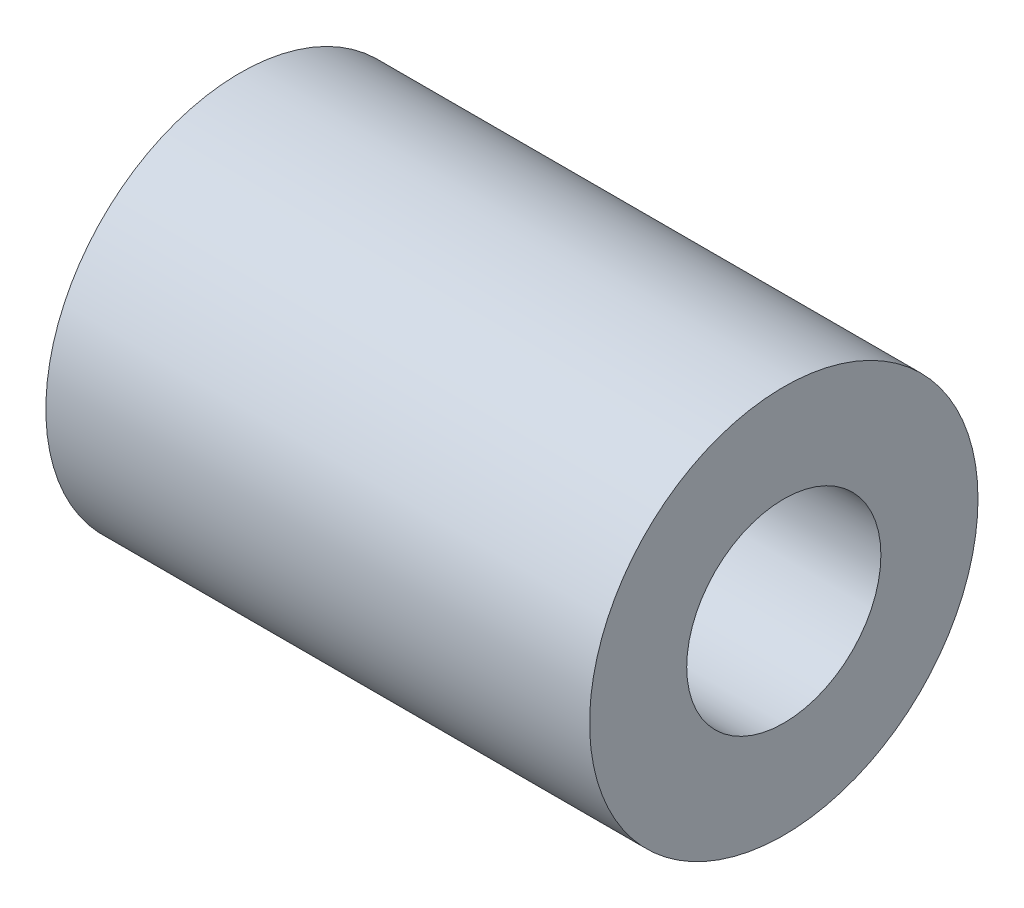
ISO-10303-21;
HEADER;
FILE_DESCRIPTION(('STEP AP214'),'2;1');
FILE_NAME('part.step','',(''),(''),'','','');
FILE_SCHEMA(('AUTOMOTIVE_DESIGN { 1 0 10303 214 1 1 1 1 }'));
ENDSEC;
DATA;
#1=APPLICATION_CONTEXT('core data for automotive mechanical design processes');
#2=APPLICATION_PROTOCOL_DEFINITION('international standard','automotive_design',2000,#1);
#3=PRODUCT_CONTEXT('',#1,'mechanical');
#4=PRODUCT('Part','Part','',(#3));
#5=PRODUCT_RELATED_PRODUCT_CATEGORY('part','',(#4));
#6=PRODUCT_DEFINITION_FORMATION('','',#4);
#7=PRODUCT_DEFINITION_CONTEXT('part definition',#1,'design');
#8=PRODUCT_DEFINITION('design','',#6,#7);
#9=PRODUCT_DEFINITION_SHAPE('','',#8);
#10=(LENGTH_UNIT() NAMED_UNIT(*) SI_UNIT(.MILLI.,.METRE.));
#11=(NAMED_UNIT(*) PLANE_ANGLE_UNIT() SI_UNIT($,.RADIAN.));
#12=(NAMED_UNIT(*) SI_UNIT($,.STERADIAN.) SOLID_ANGLE_UNIT());
#13=UNCERTAINTY_MEASURE_WITH_UNIT(LENGTH_MEASURE(1.E-05),#10,'distance_accuracy_value','');
#14=(GEOMETRIC_REPRESENTATION_CONTEXT(3) GLOBAL_UNCERTAINTY_ASSIGNED_CONTEXT((#13)) GLOBAL_UNIT_ASSIGNED_CONTEXT((#10,
#11,#12)) REPRESENTATION_CONTEXT('',''));
#15=CARTESIAN_POINT('',(0.,0.,0.));
#16=DIRECTION('',(0.,0.,1.));
#17=DIRECTION('',(1.,0.,0.));
#18=AXIS2_PLACEMENT_3D('',#15,#16,#17);
#19=CARTESIAN_POINT('',(7.,0.,0.));
#20=DIRECTION('',(1.,0.,0.));
#21=DIRECTION('',(0.,0.,-1.));
#22=AXIS2_PLACEMENT_3D('',#19,#20,#21);
#23=PLANE('',#22);
#24=CARTESIAN_POINT('',(7.,0.,0.));
#25=DIRECTION('',(1.,0.,0.));
#26=DIRECTION('',(0.,0.,-1.));
#27=AXIS2_PLACEMENT_3D('',#24,#25,#26);
#28=CIRCLE('',#27,2.5);
#29=CARTESIAN_POINT('',(7.,0.,-2.5));
#30=VERTEX_POINT('',#29);
#31=EDGE_CURVE('E10',#30,#30,#28,.T.);
#32=ORIENTED_EDGE('',*,*,#31,.T.);
#33=EDGE_LOOP('',(#32));
#34=FACE_BOUND('',#33,.T.);
#35=CARTESIAN_POINT('',(7.,0.,0.));
#36=DIRECTION('',(1.,0.,0.));
#37=DIRECTION('',(0.,0.,-1.));
#38=AXIS2_PLACEMENT_3D('',#35,#36,#37);
#39=CIRCLE('',#38,1.25);
#40=CARTESIAN_POINT('',(7.,0.,-1.25));
#41=VERTEX_POINT('',#40);
#42=EDGE_CURVE('E44',#41,#41,#39,.T.);
#43=ORIENTED_EDGE('',*,*,#42,.F.);
#44=EDGE_LOOP('',(#43));
#45=FACE_BOUND('',#44,.T.);
#46=ADVANCED_FACE('F33',(#34,#45),#23,.T.);
#47=CARTESIAN_POINT('',(0.,0.,0.));
#48=DIRECTION('',(1.,0.,0.));
#49=DIRECTION('',(0.,0.,-1.));
#50=AXIS2_PLACEMENT_3D('',#47,#48,#49);
#51=PLANE('',#50);
#52=CARTESIAN_POINT('',(0.,0.,0.));
#53=DIRECTION('',(1.,0.,0.));
#54=DIRECTION('',(0.,0.,-1.));
#55=AXIS2_PLACEMENT_3D('',#52,#53,#54);
#56=CIRCLE('',#55,2.5);
#57=CARTESIAN_POINT('',(0.,0.,-2.5));
#58=VERTEX_POINT('',#57);
#59=EDGE_CURVE('E37',#58,#58,#56,.T.);
#60=ORIENTED_EDGE('',*,*,#59,.F.);
#61=EDGE_LOOP('',(#60));
#62=FACE_BOUND('',#61,.T.);
#63=CARTESIAN_POINT('',(0.,0.,0.));
#64=DIRECTION('',(1.,0.,0.));
#65=DIRECTION('',(0.,0.,-1.));
#66=AXIS2_PLACEMENT_3D('',#63,#64,#65);
#67=CIRCLE('',#66,1.25);
#68=CARTESIAN_POINT('',(0.,0.,-1.25));
#69=VERTEX_POINT('',#68);
#70=EDGE_CURVE('E46',#69,#69,#67,.T.);
#71=ORIENTED_EDGE('',*,*,#70,.T.);
#72=EDGE_LOOP('',(#71));
#73=FACE_BOUND('',#72,.T.);
#74=ADVANCED_FACE('F56',(#62,#73),#51,.F.);
#75=CARTESIAN_POINT('',(7.,0.,0.));
#76=DIRECTION('',(-1.,0.,0.));
#77=DIRECTION('',(0.,0.,1.));
#78=AXIS2_PLACEMENT_3D('',#75,#76,#77);
#79=CYLINDRICAL_SURFACE('',#78,2.5);
#80=ORIENTED_EDGE('',*,*,#31,.F.);
#81=EDGE_LOOP('',(#80));
#82=FACE_BOUND('',#81,.T.);
#83=ORIENTED_EDGE('',*,*,#59,.T.);
#84=EDGE_LOOP('',(#83));
#85=FACE_BOUND('',#84,.T.);
#86=ADVANCED_FACE('F35',(#82,#85),#79,.T.);
#87=CARTESIAN_POINT('',(7.,0.,0.));
#88=DIRECTION('',(-1.,0.,0.));
#89=DIRECTION('',(0.,0.,1.));
#90=AXIS2_PLACEMENT_3D('',#87,#88,#89);
#91=CYLINDRICAL_SURFACE('',#90,1.25);
#92=ORIENTED_EDGE('',*,*,#42,.T.);
#93=EDGE_LOOP('',(#92));
#94=FACE_BOUND('',#93,.T.);
#95=ORIENTED_EDGE('',*,*,#70,.F.);
#96=EDGE_LOOP('',(#95));
#97=FACE_BOUND('',#96,.T.);
#98=ADVANCED_FACE('F52',(#94,#97),#91,.F.);
#99=CLOSED_SHELL('',(#46,#74,#86,#98));
#100=MANIFOLD_SOLID_BREP('B2',#99);
#101=ADVANCED_BREP_SHAPE_REPRESENTATION('',(#18,#100),#14);
#102=SHAPE_DEFINITION_REPRESENTATION(#9,#101);
ENDSEC;
END-ISO-10303-21;
